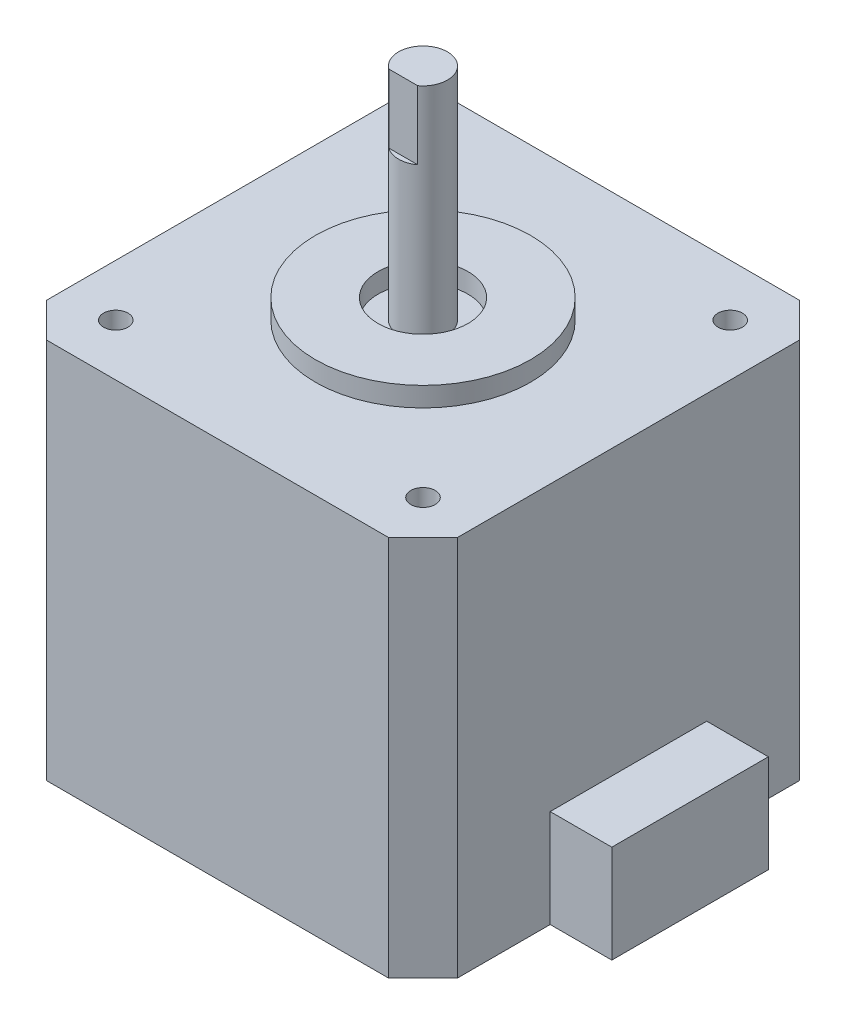
ISO-10303-21;
HEADER;
FILE_DESCRIPTION(('STEP AP214'),'2;1');
FILE_NAME('part.step','',(''),(''),'','','');
FILE_SCHEMA(('AUTOMOTIVE_DESIGN { 1 0 10303 214 1 1 1 1 }'));
ENDSEC;
DATA;
#1=APPLICATION_CONTEXT('core data for automotive mechanical design processes');
#2=APPLICATION_PROTOCOL_DEFINITION('international standard','automotive_design',2000,#1);
#3=PRODUCT_CONTEXT('',#1,'mechanical');
#4=PRODUCT('Part','Part','',(#3));
#5=PRODUCT_RELATED_PRODUCT_CATEGORY('part','',(#4));
#6=PRODUCT_DEFINITION_FORMATION('','',#4);
#7=PRODUCT_DEFINITION_CONTEXT('part definition',#1,'design');
#8=PRODUCT_DEFINITION('design','',#6,#7);
#9=PRODUCT_DEFINITION_SHAPE('','',#8);
#10=(LENGTH_UNIT() NAMED_UNIT(*) SI_UNIT(.MILLI.,.METRE.));
#11=(NAMED_UNIT(*) PLANE_ANGLE_UNIT() SI_UNIT($,.RADIAN.));
#12=(NAMED_UNIT(*) SI_UNIT($,.STERADIAN.) SOLID_ANGLE_UNIT());
#13=UNCERTAINTY_MEASURE_WITH_UNIT(LENGTH_MEASURE(1.E-05),#10,'distance_accuracy_value','');
#14=(GEOMETRIC_REPRESENTATION_CONTEXT(3) GLOBAL_UNCERTAINTY_ASSIGNED_CONTEXT((#13)) GLOBAL_UNIT_ASSIGNED_CONTEXT((#10,
#11,#12)) REPRESENTATION_CONTEXT('',''));
#15=CARTESIAN_POINT('',(0.,0.,0.));
#16=DIRECTION('',(0.,0.,1.));
#17=DIRECTION('',(1.,0.,0.));
#18=AXIS2_PLACEMENT_3D('',#15,#16,#17);
#19=CARTESIAN_POINT('',(42.,39.,-41.0140242480115));
#20=DIRECTION('',(-1.,0.,0.));
#21=DIRECTION('',(0.,0.,1.));
#22=AXIS2_PLACEMENT_3D('',#19,#20,#21);
#23=PLANE('',#22);
#24=DIRECTION('',(0.,-1.,0.));
#25=VECTOR('',#24,1.);
#26=CARTESIAN_POINT('',(42.,0.,-15.5490242480115));
#27=LINE('',#26,#25);
#28=CARTESIAN_POINT('',(42.,10.,-15.5490242480115));
#29=VERTEX_POINT('',#28);
#30=CARTESIAN_POINT('',(42.,0.,-15.5490242480115));
#31=VERTEX_POINT('',#30);
#32=EDGE_CURVE('E50',#29,#31,#27,.T.);
#33=ORIENTED_EDGE('',*,*,#32,.F.);
#34=DIRECTION('',(0.,0.,1.));
#35=VECTOR('',#34,1.);
#36=CARTESIAN_POINT('',(42.,10.,-15.5490242480115));
#37=LINE('',#36,#35);
#38=CARTESIAN_POINT('',(42.,10.,-31.5490242480115));
#39=VERTEX_POINT('',#38);
#40=EDGE_CURVE('E156',#39,#29,#37,.T.);
#41=ORIENTED_EDGE('',*,*,#40,.F.);
#42=DIRECTION('',(0.,1.,0.));
#43=VECTOR('',#42,1.);
#44=CARTESIAN_POINT('',(42.,0.,-31.5490242480115));
#45=LINE('',#44,#43);
#46=CARTESIAN_POINT('',(42.,0.,-31.5490242480115));
#47=VERTEX_POINT('',#46);
#48=EDGE_CURVE('E56',#47,#39,#45,.T.);
#49=ORIENTED_EDGE('',*,*,#48,.F.);
#50=DIRECTION('',(0.,0.,-1.));
#51=VECTOR('',#50,1.);
#52=CARTESIAN_POINT('',(42.,0.,-41.0140242480115));
#53=LINE('',#52,#51);
#54=CARTESIAN_POINT('',(42.,0.,-41.0140242480115));
#55=VERTEX_POINT('',#54);
#56=EDGE_CURVE('E237',#47,#55,#53,.T.);
#57=ORIENTED_EDGE('',*,*,#56,.T.);
#58=DIRECTION('',(0.,-1.,0.));
#59=VECTOR('',#58,1.);
#60=CARTESIAN_POINT('',(42.,39.,-41.0140242480115));
#61=LINE('',#60,#59);
#62=CARTESIAN_POINT('',(42.,39.,-41.0140242480115));
#63=VERTEX_POINT('',#62);
#64=EDGE_CURVE('E263',#63,#55,#61,.T.);
#65=ORIENTED_EDGE('',*,*,#64,.F.);
#66=DIRECTION('',(0.,0.,-1.));
#67=VECTOR('',#66,1.);
#68=CARTESIAN_POINT('',(42.,39.,-41.0140242480115));
#69=LINE('',#68,#67);
#70=CARTESIAN_POINT('',(42.,39.,-6.085092059877));
#71=VERTEX_POINT('',#70);
#72=EDGE_CURVE('E220',#71,#63,#69,.T.);
#73=ORIENTED_EDGE('',*,*,#72,.F.);
#74=DIRECTION('',(0.,-1.,0.));
#75=VECTOR('',#74,1.);
#76=CARTESIAN_POINT('',(42.,39.,-6.085092059877));
#77=LINE('',#76,#75);
#78=CARTESIAN_POINT('',(42.,0.,-6.085092059877));
#79=VERTEX_POINT('',#78);
#80=EDGE_CURVE('E266',#71,#79,#77,.T.);
#81=ORIENTED_EDGE('',*,*,#80,.T.);
#82=EDGE_CURVE('E238',#79,#31,#53,.T.);
#83=ORIENTED_EDGE('',*,*,#82,.T.);
#84=EDGE_LOOP('',(#33,#41,#49,#57,#65,#73,#81,#83));
#85=FACE_BOUND('',#84,.T.);
#86=ADVANCED_FACE('F35',(#85),#23,.F.);
#87=CARTESIAN_POINT('',(38.4644660940673,39.,-2.54955815394427));
#88=DIRECTION('',(0.,0.,-1.));
#89=DIRECTION('',(-1.,0.,0.));
#90=AXIS2_PLACEMENT_3D('',#87,#88,#89);
#91=PLANE('',#90);
#92=DIRECTION('',(1.,0.,0.));
#93=VECTOR('',#92,1.);
#94=CARTESIAN_POINT('',(38.4644660940673,0.,-2.54955815394427));
#95=LINE('',#94,#93);
#96=CARTESIAN_POINT('',(3.53553390593273,0.,-2.54955815394426));
#97=VERTEX_POINT('',#96);
#98=CARTESIAN_POINT('',(38.4644660940673,0.,-2.54955815394427));
#99=VERTEX_POINT('',#98);
#100=EDGE_CURVE('E211',#97,#99,#95,.T.);
#101=ORIENTED_EDGE('',*,*,#100,.T.);
#102=DIRECTION('',(0.,-1.,0.));
#103=VECTOR('',#102,1.);
#104=CARTESIAN_POINT('',(38.4644660940673,39.,-2.54955815394427));
#105=LINE('',#104,#103);
#106=CARTESIAN_POINT('',(38.4644660940673,39.,-2.54955815394427));
#107=VERTEX_POINT('',#106);
#108=EDGE_CURVE('E269',#107,#99,#105,.T.);
#109=ORIENTED_EDGE('',*,*,#108,.F.);
#110=DIRECTION('',(1.,0.,0.));
#111=VECTOR('',#110,1.);
#112=CARTESIAN_POINT('',(38.4644660940673,39.,-2.54955815394427));
#113=LINE('',#112,#111);
#114=CARTESIAN_POINT('',(3.53553390593273,39.,-2.54955815394426));
#115=VERTEX_POINT('',#114);
#116=EDGE_CURVE('E214',#115,#107,#113,.T.);
#117=ORIENTED_EDGE('',*,*,#116,.F.);
#118=DIRECTION('',(0.,-1.,0.));
#119=VECTOR('',#118,1.);
#120=CARTESIAN_POINT('',(3.53553390593273,39.,-2.54955815394426));
#121=LINE('',#120,#119);
#122=EDGE_CURVE('E232',#115,#97,#121,.T.);
#123=ORIENTED_EDGE('',*,*,#122,.T.);
#124=EDGE_LOOP('',(#101,#109,#117,#123));
#125=FACE_BOUND('',#124,.T.);
#126=ADVANCED_FACE('F37',(#125),#91,.F.);
#127=CARTESIAN_POINT('',(42.,39.,-6.085092059877));
#128=DIRECTION('',(-0.707106781186547,0.,-0.707106781186548));
#129=DIRECTION('',(-0.707106781186548,0.,0.707106781186547));
#130=AXIS2_PLACEMENT_3D('',#127,#128,#129);
#131=PLANE('',#130);
#132=DIRECTION('',(0.707106781186548,0.,-0.707106781186547));
#133=VECTOR('',#132,1.);
#134=CARTESIAN_POINT('',(42.,0.,-6.085092059877));
#135=LINE('',#134,#133);
#136=EDGE_CURVE('E235',#99,#79,#135,.T.);
#137=ORIENTED_EDGE('',*,*,#136,.T.);
#138=ORIENTED_EDGE('',*,*,#80,.F.);
#139=DIRECTION('',(0.707106781186548,0.,-0.707106781186547));
#140=VECTOR('',#139,1.);
#141=CARTESIAN_POINT('',(42.,39.,-6.085092059877));
#142=LINE('',#141,#140);
#143=EDGE_CURVE('E217',#107,#71,#142,.T.);
#144=ORIENTED_EDGE('',*,*,#143,.F.);
#145=ORIENTED_EDGE('',*,*,#108,.T.);
#146=EDGE_LOOP('',(#137,#138,#144,#145));
#147=FACE_BOUND('',#146,.T.);
#148=ADVANCED_FACE('F297',(#147),#131,.F.);
#149=CARTESIAN_POINT('',(38.4644660940673,39.,-44.5495581539443));
#150=DIRECTION('',(-0.707106781186549,0.,0.707106781186546));
#151=DIRECTION('',(0.707106781186546,0.,0.707106781186549));
#152=AXIS2_PLACEMENT_3D('',#149,#150,#151);
#153=PLANE('',#152);
#154=DIRECTION('',(-0.707106781186546,0.,-0.707106781186549));
#155=VECTOR('',#154,1.);
#156=CARTESIAN_POINT('',(38.4644660940673,0.,-44.5495581539443));
#157=LINE('',#156,#155);
#158=CARTESIAN_POINT('',(38.4644660940673,0.,-44.5495581539443));
#159=VERTEX_POINT('',#158);
#160=EDGE_CURVE('E240',#55,#159,#157,.T.);
#161=ORIENTED_EDGE('',*,*,#160,.T.);
#162=DIRECTION('',(0.,-1.,0.));
#163=VECTOR('',#162,1.);
#164=CARTESIAN_POINT('',(38.4644660940673,39.,-44.5495581539443));
#165=LINE('',#164,#163);
#166=CARTESIAN_POINT('',(38.4644660940673,39.,-44.5495581539443));
#167=VERTEX_POINT('',#166);
#168=EDGE_CURVE('E260',#167,#159,#165,.T.);
#169=ORIENTED_EDGE('',*,*,#168,.F.);
#170=DIRECTION('',(-0.707106781186546,0.,-0.707106781186549));
#171=VECTOR('',#170,1.);
#172=CARTESIAN_POINT('',(38.4644660940673,39.,-44.5495581539443));
#173=LINE('',#172,#171);
#174=EDGE_CURVE('E222',#63,#167,#173,.T.);
#175=ORIENTED_EDGE('',*,*,#174,.F.);
#176=ORIENTED_EDGE('',*,*,#64,.T.);
#177=EDGE_LOOP('',(#161,#169,#175,#176));
#178=FACE_BOUND('',#177,.T.);
#179=ADVANCED_FACE('F305',(#178),#153,.F.);
#180=CARTESIAN_POINT('',(3.53553390593274,39.,-44.5495581539443));
#181=DIRECTION('',(0.,0.,1.));
#182=DIRECTION('',(1.,0.,0.));
#183=AXIS2_PLACEMENT_3D('',#180,#181,#182);
#184=PLANE('',#183);
#185=DIRECTION('',(-1.,0.,0.));
#186=VECTOR('',#185,1.);
#187=CARTESIAN_POINT('',(3.53553390593274,0.,-44.5495581539443));
#188=LINE('',#187,#186);
#189=CARTESIAN_POINT('',(3.53553390593274,0.,-44.5495581539443));
#190=VERTEX_POINT('',#189);
#191=EDGE_CURVE('E242',#159,#190,#188,.T.);
#192=ORIENTED_EDGE('',*,*,#191,.T.);
#193=DIRECTION('',(0.,-1.,0.));
#194=VECTOR('',#193,1.);
#195=CARTESIAN_POINT('',(3.53553390593274,39.,-44.5495581539443));
#196=LINE('',#195,#194);
#197=CARTESIAN_POINT('',(3.53553390593274,39.,-44.5495581539443));
#198=VERTEX_POINT('',#197);
#199=EDGE_CURVE('E257',#198,#190,#196,.T.);
#200=ORIENTED_EDGE('',*,*,#199,.F.);
#201=DIRECTION('',(-1.,0.,0.));
#202=VECTOR('',#201,1.);
#203=CARTESIAN_POINT('',(3.53553390593274,39.,-44.5495581539443));
#204=LINE('',#203,#202);
#205=EDGE_CURVE('E224',#167,#198,#204,.T.);
#206=ORIENTED_EDGE('',*,*,#205,.F.);
#207=ORIENTED_EDGE('',*,*,#168,.T.);
#208=EDGE_LOOP('',(#192,#200,#206,#207));
#209=FACE_BOUND('',#208,.T.);
#210=ADVANCED_FACE('F309',(#209),#184,.F.);
#211=CARTESIAN_POINT('',(0.,39.,-41.0140242480115));
#212=DIRECTION('',(0.707106781186546,0.,0.707106781186549));
#213=DIRECTION('',(0.707106781186549,0.,-0.707106781186546));
#214=AXIS2_PLACEMENT_3D('',#211,#212,#213);
#215=PLANE('',#214);
#216=DIRECTION('',(-0.707106781186549,0.,0.707106781186546));
#217=VECTOR('',#216,1.);
#218=CARTESIAN_POINT('',(0.,0.,-41.0140242480115));
#219=LINE('',#218,#217);
#220=CARTESIAN_POINT('',(0.,0.,-41.0140242480115));
#221=VERTEX_POINT('',#220);
#222=EDGE_CURVE('E244',#190,#221,#219,.T.);
#223=ORIENTED_EDGE('',*,*,#222,.T.);
#224=DIRECTION('',(0.,-1.,0.));
#225=VECTOR('',#224,1.);
#226=CARTESIAN_POINT('',(0.,39.,-41.0140242480115));
#227=LINE('',#226,#225);
#228=CARTESIAN_POINT('',(0.,39.,-41.0140242480115));
#229=VERTEX_POINT('',#228);
#230=EDGE_CURVE('E254',#229,#221,#227,.T.);
#231=ORIENTED_EDGE('',*,*,#230,.F.);
#232=DIRECTION('',(-0.707106781186549,0.,0.707106781186546));
#233=VECTOR('',#232,1.);
#234=CARTESIAN_POINT('',(0.,39.,-41.0140242480115));
#235=LINE('',#234,#233);
#236=EDGE_CURVE('E226',#198,#229,#235,.T.);
#237=ORIENTED_EDGE('',*,*,#236,.F.);
#238=ORIENTED_EDGE('',*,*,#199,.T.);
#239=EDGE_LOOP('',(#223,#231,#237,#238));
#240=FACE_BOUND('',#239,.T.);
#241=ADVANCED_FACE('F314',(#240),#215,.F.);
#242=CARTESIAN_POINT('',(0.,39.,-6.085092059877));
#243=DIRECTION('',(1.,0.,0.));
#244=DIRECTION('',(0.,0.,-1.));
#245=AXIS2_PLACEMENT_3D('',#242,#243,#244);
#246=PLANE('',#245);
#247=DIRECTION('',(0.,0.,1.));
#248=VECTOR('',#247,1.);
#249=CARTESIAN_POINT('',(0.,0.,-6.085092059877));
#250=LINE('',#249,#248);
#251=CARTESIAN_POINT('',(0.,0.,-6.085092059877));
#252=VERTEX_POINT('',#251);
#253=EDGE_CURVE('E246',#221,#252,#250,.T.);
#254=ORIENTED_EDGE('',*,*,#253,.T.);
#255=DIRECTION('',(0.,-1.,0.));
#256=VECTOR('',#255,1.);
#257=CARTESIAN_POINT('',(0.,39.,-6.085092059877));
#258=LINE('',#257,#256);
#259=CARTESIAN_POINT('',(0.,39.,-6.085092059877));
#260=VERTEX_POINT('',#259);
#261=EDGE_CURVE('E251',#260,#252,#258,.T.);
#262=ORIENTED_EDGE('',*,*,#261,.F.);
#263=DIRECTION('',(0.,0.,1.));
#264=VECTOR('',#263,1.);
#265=CARTESIAN_POINT('',(0.,39.,-6.085092059877));
#266=LINE('',#265,#264);
#267=EDGE_CURVE('E228',#229,#260,#266,.T.);
#268=ORIENTED_EDGE('',*,*,#267,.F.);
#269=ORIENTED_EDGE('',*,*,#230,.T.);
#270=EDGE_LOOP('',(#254,#262,#268,#269));
#271=FACE_BOUND('',#270,.T.);
#272=ADVANCED_FACE('F318',(#271),#246,.F.);
#273=CARTESIAN_POINT('',(3.53553390593273,39.,-2.54955815394426));
#274=DIRECTION('',(0.707106781186549,0.,-0.707106781186546));
#275=DIRECTION('',(-0.707106781186546,0.,-0.707106781186549));
#276=AXIS2_PLACEMENT_3D('',#273,#274,#275);
#277=PLANE('',#276);
#278=DIRECTION('',(0.707106781186546,0.,0.707106781186549));
#279=VECTOR('',#278,1.);
#280=CARTESIAN_POINT('',(3.53553390593273,0.,-2.54955815394426));
#281=LINE('',#280,#279);
#282=EDGE_CURVE('E218',#252,#97,#281,.T.);
#283=ORIENTED_EDGE('',*,*,#282,.T.);
#284=ORIENTED_EDGE('',*,*,#122,.F.);
#285=DIRECTION('',(0.707106781186546,0.,0.707106781186549));
#286=VECTOR('',#285,1.);
#287=CARTESIAN_POINT('',(3.53553390593273,39.,-2.54955815394426));
#288=LINE('',#287,#286);
#289=EDGE_CURVE('E230',#260,#115,#288,.T.);
#290=ORIENTED_EDGE('',*,*,#289,.F.);
#291=ORIENTED_EDGE('',*,*,#261,.T.);
#292=EDGE_LOOP('',(#283,#284,#290,#291));
#293=FACE_BOUND('',#292,.T.);
#294=ADVANCED_FACE('F279',(#293),#277,.F.);
#295=CARTESIAN_POINT('',(0.,39.,0.));
#296=DIRECTION('',(0.,-1.,0.));
#297=DIRECTION('',(0.,0.,-1.));
#298=AXIS2_PLACEMENT_3D('',#295,#296,#297);
#299=PLANE('',#298);
#300=CARTESIAN_POINT('',(21.,39.,-23.5495581539443));
#301=DIRECTION('',(0.,-1.,0.));
#302=DIRECTION('',(0.,0.,-1.));
#303=AXIS2_PLACEMENT_3D('',#300,#301,#302);
#304=CIRCLE('',#303,11.);
#305=CARTESIAN_POINT('',(21.,39.,-34.5495581539443));
#306=VERTEX_POINT('',#305);
#307=EDGE_CURVE('E43',#306,#306,#304,.F.);
#308=ORIENTED_EDGE('',*,*,#307,.F.);
#309=EDGE_LOOP('',(#308));
#310=FACE_BOUND('',#309,.T.);
#311=CARTESIAN_POINT('',(5.3,39.,-7.84955815394426));
#312=DIRECTION('',(0.,1.,0.));
#313=DIRECTION('',(0.,0.,1.));
#314=AXIS2_PLACEMENT_3D('',#311,#312,#313);
#315=CIRCLE('',#314,1.25);
#316=CARTESIAN_POINT('',(5.3,39.,-6.59955815394426));
#317=VERTEX_POINT('',#316);
#318=EDGE_CURVE('E189',#317,#317,#315,.T.);
#319=ORIENTED_EDGE('',*,*,#318,.F.);
#320=EDGE_LOOP('',(#319));
#321=FACE_BOUND('',#320,.T.);
#322=CARTESIAN_POINT('',(36.7,39.,-7.84955815394426));
#323=DIRECTION('',(0.,1.,0.));
#324=DIRECTION('',(0.,0.,1.));
#325=AXIS2_PLACEMENT_3D('',#322,#323,#324);
#326=CIRCLE('',#325,1.25);
#327=CARTESIAN_POINT('',(36.7,39.,-6.59955815394426));
#328=VERTEX_POINT('',#327);
#329=EDGE_CURVE('E200',#328,#328,#326,.T.);
#330=ORIENTED_EDGE('',*,*,#329,.F.);
#331=EDGE_LOOP('',(#330));
#332=FACE_BOUND('',#331,.T.);
#333=CARTESIAN_POINT('',(36.7,39.,-39.2495581539443));
#334=DIRECTION('',(0.,1.,0.));
#335=DIRECTION('',(0.,0.,1.));
#336=AXIS2_PLACEMENT_3D('',#333,#334,#335);
#337=CIRCLE('',#336,1.25);
#338=CARTESIAN_POINT('',(36.7,39.,-37.9995581539443));
#339=VERTEX_POINT('',#338);
#340=EDGE_CURVE('E194',#339,#339,#337,.T.);
#341=ORIENTED_EDGE('',*,*,#340,.F.);
#342=EDGE_LOOP('',(#341));
#343=FACE_BOUND('',#342,.T.);
#344=CARTESIAN_POINT('',(5.3,39.,-39.2495581539443));
#345=DIRECTION('',(0.,1.,0.));
#346=DIRECTION('',(0.,0.,1.));
#347=AXIS2_PLACEMENT_3D('',#344,#345,#346);
#348=CIRCLE('',#347,1.25);
#349=CARTESIAN_POINT('',(5.3,39.,-37.9995581539443));
#350=VERTEX_POINT('',#349);
#351=EDGE_CURVE('E193',#350,#350,#348,.T.);
#352=ORIENTED_EDGE('',*,*,#351,.F.);
#353=EDGE_LOOP('',(#352));
#354=FACE_BOUND('',#353,.T.);
#355=ORIENTED_EDGE('',*,*,#116,.T.);
#356=ORIENTED_EDGE('',*,*,#143,.T.);
#357=ORIENTED_EDGE('',*,*,#72,.T.);
#358=ORIENTED_EDGE('',*,*,#174,.T.);
#359=ORIENTED_EDGE('',*,*,#205,.T.);
#360=ORIENTED_EDGE('',*,*,#236,.T.);
#361=ORIENTED_EDGE('',*,*,#267,.T.);
#362=ORIENTED_EDGE('',*,*,#289,.T.);
#363=EDGE_LOOP('',(#355,#356,#357,#358,#359,#360,#361,#362));
#364=FACE_BOUND('',#363,.T.);
#365=ADVANCED_FACE('F276',(#310,#321,#332,#343,#354,#364),#299,.F.);
#366=CARTESIAN_POINT('',(0.,0.,0.));
#367=DIRECTION('',(0.,-1.,0.));
#368=DIRECTION('',(0.,0.,-1.));
#369=AXIS2_PLACEMENT_3D('',#366,#367,#368);
#370=PLANE('',#369);
#371=CARTESIAN_POINT('',(5.3,0.,-7.84955815394426));
#372=DIRECTION('',(0.,1.,0.));
#373=DIRECTION('',(0.,0.,1.));
#374=AXIS2_PLACEMENT_3D('',#371,#372,#373);
#375=CIRCLE('',#374,1.25);
#376=CARTESIAN_POINT('',(5.3,0.,-6.59955815394426));
#377=VERTEX_POINT('',#376);
#378=EDGE_CURVE('E203',#377,#377,#375,.T.);
#379=ORIENTED_EDGE('',*,*,#378,.T.);
#380=EDGE_LOOP('',(#379));
#381=FACE_BOUND('',#380,.T.);
#382=CARTESIAN_POINT('',(36.7,0.,-7.84955815394426));
#383=DIRECTION('',(0.,1.,0.));
#384=DIRECTION('',(0.,0.,1.));
#385=AXIS2_PLACEMENT_3D('',#382,#383,#384);
#386=CIRCLE('',#385,1.25);
#387=CARTESIAN_POINT('',(36.7,0.,-6.59955815394426));
#388=VERTEX_POINT('',#387);
#389=EDGE_CURVE('E197',#388,#388,#386,.T.);
#390=ORIENTED_EDGE('',*,*,#389,.T.);
#391=EDGE_LOOP('',(#390));
#392=FACE_BOUND('',#391,.T.);
#393=CARTESIAN_POINT('',(36.7,0.,-39.2495581539443));
#394=DIRECTION('',(0.,1.,0.));
#395=DIRECTION('',(0.,0.,1.));
#396=AXIS2_PLACEMENT_3D('',#393,#394,#395);
#397=CIRCLE('',#396,1.25);
#398=CARTESIAN_POINT('',(36.7,0.,-37.9995581539443));
#399=VERTEX_POINT('',#398);
#400=EDGE_CURVE('E190',#399,#399,#397,.T.);
#401=ORIENTED_EDGE('',*,*,#400,.T.);
#402=EDGE_LOOP('',(#401));
#403=FACE_BOUND('',#402,.T.);
#404=CARTESIAN_POINT('',(5.3,0.,-39.2495581539443));
#405=DIRECTION('',(0.,1.,0.));
#406=DIRECTION('',(0.,0.,1.));
#407=AXIS2_PLACEMENT_3D('',#404,#405,#406);
#408=CIRCLE('',#407,1.25);
#409=CARTESIAN_POINT('',(5.3,0.,-37.9995581539443));
#410=VERTEX_POINT('',#409);
#411=EDGE_CURVE('E208',#410,#410,#408,.T.);
#412=ORIENTED_EDGE('',*,*,#411,.T.);
#413=EDGE_LOOP('',(#412));
#414=FACE_BOUND('',#413,.T.);
#415=ORIENTED_EDGE('',*,*,#100,.F.);
#416=ORIENTED_EDGE('',*,*,#282,.F.);
#417=ORIENTED_EDGE('',*,*,#253,.F.);
#418=ORIENTED_EDGE('',*,*,#222,.F.);
#419=ORIENTED_EDGE('',*,*,#191,.F.);
#420=ORIENTED_EDGE('',*,*,#160,.F.);
#421=ORIENTED_EDGE('',*,*,#56,.F.);
#422=DIRECTION('',(-1.,0.,0.));
#423=VECTOR('',#422,1.);
#424=CARTESIAN_POINT('',(48.3,0.,-31.5490242480115));
#425=LINE('',#424,#423);
#426=CARTESIAN_POINT('',(48.3,0.,-31.5490242480115));
#427=VERTEX_POINT('',#426);
#428=EDGE_CURVE('E143',#427,#47,#425,.T.);
#429=ORIENTED_EDGE('',*,*,#428,.F.);
#430=DIRECTION('',(0.,0.,-1.));
#431=VECTOR('',#430,1.);
#432=CARTESIAN_POINT('',(48.3,0.,-15.5490242480115));
#433=LINE('',#432,#431);
#434=CARTESIAN_POINT('',(48.3,0.,-15.5490242480115));
#435=VERTEX_POINT('',#434);
#436=EDGE_CURVE('E135',#435,#427,#433,.T.);
#437=ORIENTED_EDGE('',*,*,#436,.F.);
#438=DIRECTION('',(-1.,0.,0.));
#439=VECTOR('',#438,1.);
#440=CARTESIAN_POINT('',(48.3,0.,-15.5490242480115));
#441=LINE('',#440,#439);
#442=EDGE_CURVE('E141',#435,#31,#441,.T.);
#443=ORIENTED_EDGE('',*,*,#442,.T.);
#444=ORIENTED_EDGE('',*,*,#82,.F.);
#445=ORIENTED_EDGE('',*,*,#136,.F.);
#446=EDGE_LOOP('',(#415,#416,#417,#418,#419,#420,#421,#429,#437,#443,#444,#445));
#447=FACE_BOUND('',#446,.T.);
#448=ADVANCED_FACE('F138',(#381,#392,#403,#414,#447),#370,.T.);
#449=CARTESIAN_POINT('',(5.3,0.,-39.2495581539443));
#450=DIRECTION('',(0.,1.,0.));
#451=DIRECTION('',(0.,0.,1.));
#452=AXIS2_PLACEMENT_3D('',#449,#450,#451);
#453=CYLINDRICAL_SURFACE('',#452,1.25);
#454=ORIENTED_EDGE('',*,*,#411,.F.);
#455=EDGE_LOOP('',(#454));
#456=FACE_BOUND('',#455,.T.);
#457=ORIENTED_EDGE('',*,*,#351,.T.);
#458=EDGE_LOOP('',(#457));
#459=FACE_BOUND('',#458,.T.);
#460=ADVANCED_FACE('F367',(#456,#459),#453,.F.);
#461=CARTESIAN_POINT('',(36.7,0.,-39.2495581539443));
#462=DIRECTION('',(0.,1.,0.));
#463=DIRECTION('',(0.,0.,1.));
#464=AXIS2_PLACEMENT_3D('',#461,#462,#463);
#465=CYLINDRICAL_SURFACE('',#464,1.25);
#466=ORIENTED_EDGE('',*,*,#400,.F.);
#467=EDGE_LOOP('',(#466));
#468=FACE_BOUND('',#467,.T.);
#469=ORIENTED_EDGE('',*,*,#340,.T.);
#470=EDGE_LOOP('',(#469));
#471=FACE_BOUND('',#470,.T.);
#472=ADVANCED_FACE('F372',(#468,#471),#465,.F.);
#473=CARTESIAN_POINT('',(36.7,0.,-7.84955815394426));
#474=DIRECTION('',(0.,1.,0.));
#475=DIRECTION('',(0.,0.,1.));
#476=AXIS2_PLACEMENT_3D('',#473,#474,#475);
#477=CYLINDRICAL_SURFACE('',#476,1.25);
#478=ORIENTED_EDGE('',*,*,#389,.F.);
#479=EDGE_LOOP('',(#478));
#480=FACE_BOUND('',#479,.T.);
#481=ORIENTED_EDGE('',*,*,#329,.T.);
#482=EDGE_LOOP('',(#481));
#483=FACE_BOUND('',#482,.T.);
#484=ADVANCED_FACE('F378',(#480,#483),#477,.F.);
#485=CARTESIAN_POINT('',(5.3,0.,-7.84955815394426));
#486=DIRECTION('',(0.,1.,0.));
#487=DIRECTION('',(0.,0.,1.));
#488=AXIS2_PLACEMENT_3D('',#485,#486,#487);
#489=CYLINDRICAL_SURFACE('',#488,1.25);
#490=ORIENTED_EDGE('',*,*,#378,.F.);
#491=EDGE_LOOP('',(#490));
#492=FACE_BOUND('',#491,.T.);
#493=ORIENTED_EDGE('',*,*,#318,.T.);
#494=EDGE_LOOP('',(#493));
#495=FACE_BOUND('',#494,.T.);
#496=ADVANCED_FACE('F374',(#492,#495),#489,.F.);
#497=CARTESIAN_POINT('',(21.,41.,-23.5495581539443));
#498=DIRECTION('',(0.,1.,0.));
#499=DIRECTION('',(0.,0.,1.));
#500=AXIS2_PLACEMENT_3D('',#497,#498,#499);
#501=PLANE('',#500);
#502=CARTESIAN_POINT('',(21.,41.,-23.5495581539443));
#503=DIRECTION('',(0.,1.,0.));
#504=DIRECTION('',(0.,0.,1.));
#505=AXIS2_PLACEMENT_3D('',#502,#503,#504);
#506=CIRCLE('',#505,11.);
#507=CARTESIAN_POINT('',(21.,41.,-12.5495581539443));
#508=VERTEX_POINT('',#507);
#509=EDGE_CURVE('E184',#508,#508,#506,.T.);
#510=ORIENTED_EDGE('',*,*,#509,.T.);
#511=EDGE_LOOP('',(#510));
#512=FACE_BOUND('',#511,.T.);
#513=CARTESIAN_POINT('',(21.,41.,-23.5495581539443));
#514=DIRECTION('',(0.,1.,0.));
#515=DIRECTION('',(0.,0.,1.));
#516=AXIS2_PLACEMENT_3D('',#513,#514,#515);
#517=CIRCLE('',#516,4.6);
#518=CARTESIAN_POINT('',(21.,41.,-18.9495581539443));
#519=VERTEX_POINT('',#518);
#520=EDGE_CURVE('E181',#519,#519,#517,.T.);
#521=ORIENTED_EDGE('',*,*,#520,.F.);
#522=EDGE_LOOP('',(#521));
#523=FACE_BOUND('',#522,.T.);
#524=ADVANCED_FACE('F377',(#512,#523),#501,.T.);
#525=CARTESIAN_POINT('',(21.,41.,-23.5495581539443));
#526=DIRECTION('',(0.,-1.,0.));
#527=DIRECTION('',(0.,0.,-1.));
#528=AXIS2_PLACEMENT_3D('',#525,#526,#527);
#529=CYLINDRICAL_SURFACE('',#528,11.);
#530=ORIENTED_EDGE('',*,*,#509,.F.);
#531=EDGE_LOOP('',(#530));
#532=FACE_BOUND('',#531,.T.);
#533=ORIENTED_EDGE('',*,*,#307,.T.);
#534=EDGE_LOOP('',(#533));
#535=FACE_BOUND('',#534,.T.);
#536=ADVANCED_FACE('F274',(#532,#535),#529,.T.);
#537=CARTESIAN_POINT('',(21.,41.,-23.5495581539443));
#538=DIRECTION('',(0.,-1.,0.));
#539=DIRECTION('',(0.,0.,-1.));
#540=AXIS2_PLACEMENT_3D('',#537,#538,#539);
#541=CYLINDRICAL_SURFACE('',#540,4.6);
#542=ORIENTED_EDGE('',*,*,#520,.T.);
#543=EDGE_LOOP('',(#542));
#544=FACE_BOUND('',#543,.T.);
#545=CARTESIAN_POINT('',(21.,39.,-23.5495581539443));
#546=DIRECTION('',(0.,1.,0.));
#547=DIRECTION('',(0.,0.,1.));
#548=AXIS2_PLACEMENT_3D('',#545,#546,#547);
#549=CIRCLE('',#548,4.6);
#550=CARTESIAN_POINT('',(21.,39.,-18.9495581539443));
#551=VERTEX_POINT('',#550);
#552=EDGE_CURVE('E180',#551,#551,#549,.T.);
#553=ORIENTED_EDGE('',*,*,#552,.F.);
#554=EDGE_LOOP('',(#553));
#555=FACE_BOUND('',#554,.T.);
#556=ADVANCED_FACE('F388',(#544,#555),#541,.F.);
#557=CARTESIAN_POINT('',(21.,39.,-23.5495581539443));
#558=DIRECTION('',(0.,-1.,0.));
#559=DIRECTION('',(0.,0.,-1.));
#560=AXIS2_PLACEMENT_3D('',#557,#558,#559);
#561=CIRCLE('',#560,2.5);
#562=CARTESIAN_POINT('',(21.,39.,-26.0495581539443));
#563=VERTEX_POINT('',#562);
#564=EDGE_CURVE('E11',#563,#563,#561,.F.);
#565=ORIENTED_EDGE('',*,*,#564,.F.);
#566=EDGE_LOOP('',(#565));
#567=FACE_BOUND('',#566,.T.);
#568=ORIENTED_EDGE('',*,*,#552,.T.);
#569=EDGE_LOOP('',(#568));
#570=FACE_BOUND('',#569,.T.);
#571=ADVANCED_FACE('F281',(#567,#570),#299,.F.);
#572=CARTESIAN_POINT('',(21.,61.5,-23.5495581539443));
#573=DIRECTION('',(0.,-1.,0.));
#574=DIRECTION('',(0.,0.,-1.));
#575=AXIS2_PLACEMENT_3D('',#572,#573,#574);
#576=CYLINDRICAL_SURFACE('',#575,2.5);
#577=CARTESIAN_POINT('',(21.,61.5,-23.5495581539443));
#578=DIRECTION('',(0.,1.,0.));
#579=DIRECTION('',(0.,0.,1.));
#580=AXIS2_PLACEMENT_3D('',#577,#578,#579);
#581=CIRCLE('',#580,2.5);
#582=CARTESIAN_POINT('',(22.4749091596639,61.5,-21.5309836641769));
#583=VERTEX_POINT('',#582);
#584=CARTESIAN_POINT('',(19.5250908403361,61.5,-21.5309836641769));
#585=VERTEX_POINT('',#584);
#586=EDGE_CURVE('E175',#583,#585,#581,.T.);
#587=ORIENTED_EDGE('',*,*,#586,.F.);
#588=DIRECTION('',(0.,1.,0.));
#589=VECTOR('',#588,1.);
#590=CARTESIAN_POINT('',(22.4749091596639,54.5,-21.5309836641769));
#591=LINE('',#590,#589);
#592=CARTESIAN_POINT('',(22.4749091596639,54.5,-21.5309836641769));
#593=VERTEX_POINT('',#592);
#594=EDGE_CURVE('E173',#593,#583,#591,.T.);
#595=ORIENTED_EDGE('',*,*,#594,.F.);
#596=CARTESIAN_POINT('',(21.,54.5,-23.5495581539443));
#597=DIRECTION('',(0.,-1.,0.));
#598=DIRECTION('',(0.,0.,-1.));
#599=AXIS2_PLACEMENT_3D('',#596,#597,#598);
#600=CIRCLE('',#599,2.5);
#601=CARTESIAN_POINT('',(19.5250908403361,54.5,-21.5309836641769));
#602=VERTEX_POINT('',#601);
#603=EDGE_CURVE('E169',#593,#602,#600,.T.);
#604=ORIENTED_EDGE('',*,*,#603,.T.);
#605=DIRECTION('',(0.,1.,0.));
#606=VECTOR('',#605,1.);
#607=CARTESIAN_POINT('',(19.5250908403361,54.5,-21.5309836641769));
#608=LINE('',#607,#606);
#609=EDGE_CURVE('E171',#602,#585,#608,.T.);
#610=ORIENTED_EDGE('',*,*,#609,.T.);
#611=EDGE_LOOP('',(#587,#595,#604,#610));
#612=FACE_BOUND('',#611,.T.);
#613=ORIENTED_EDGE('',*,*,#564,.T.);
#614=EDGE_LOOP('',(#613));
#615=FACE_BOUND('',#614,.T.);
#616=ADVANCED_FACE('F396',(#612,#615),#576,.T.);
#617=CARTESIAN_POINT('',(21.,61.5,-23.5495581539443));
#618=DIRECTION('',(0.,1.,0.));
#619=DIRECTION('',(0.,0.,1.));
#620=AXIS2_PLACEMENT_3D('',#617,#618,#619);
#621=PLANE('',#620);
#622=DIRECTION('',(-1.,0.,0.));
#623=VECTOR('',#622,1.);
#624=CARTESIAN_POINT('',(22.4749091596639,61.5,-21.5309836641769));
#625=LINE('',#624,#623);
#626=EDGE_CURVE('E159',#583,#585,#625,.T.);
#627=ORIENTED_EDGE('',*,*,#626,.F.);
#628=ORIENTED_EDGE('',*,*,#586,.T.);
#629=EDGE_LOOP('',(#627,#628));
#630=FACE_BOUND('',#629,.T.);
#631=ADVANCED_FACE('F399',(#630),#621,.T.);
#632=CARTESIAN_POINT('',(22.4749091596639,54.5,-21.5309836641769));
#633=DIRECTION('',(0.,0.,-1.));
#634=DIRECTION('',(-1.,0.,0.));
#635=AXIS2_PLACEMENT_3D('',#632,#633,#634);
#636=PLANE('',#635);
#637=ORIENTED_EDGE('',*,*,#626,.T.);
#638=ORIENTED_EDGE('',*,*,#609,.F.);
#639=DIRECTION('',(-1.,0.,0.));
#640=VECTOR('',#639,1.);
#641=CARTESIAN_POINT('',(22.4749091596639,54.5,-21.5309836641769));
#642=LINE('',#641,#640);
#643=EDGE_CURVE('E161',#593,#602,#642,.T.);
#644=ORIENTED_EDGE('',*,*,#643,.F.);
#645=ORIENTED_EDGE('',*,*,#594,.T.);
#646=EDGE_LOOP('',(#637,#638,#644,#645));
#647=FACE_BOUND('',#646,.T.);
#648=ADVANCED_FACE('F403',(#647),#636,.F.);
#649=CARTESIAN_POINT('',(21.,54.5,-23.5495581539443));
#650=DIRECTION('',(0.,-1.,0.));
#651=DIRECTION('',(0.,0.,-1.));
#652=AXIS2_PLACEMENT_3D('',#649,#650,#651);
#653=PLANE('',#652);
#654=ORIENTED_EDGE('',*,*,#643,.T.);
#655=ORIENTED_EDGE('',*,*,#603,.F.);
#656=EDGE_LOOP('',(#654,#655));
#657=FACE_BOUND('',#656,.T.);
#658=ADVANCED_FACE('F407',(#657),#653,.F.);
#659=CARTESIAN_POINT('',(48.3,0.,-15.5490242480115));
#660=DIRECTION('',(0.,0.,-1.));
#661=DIRECTION('',(-1.,0.,0.));
#662=AXIS2_PLACEMENT_3D('',#659,#660,#661);
#663=PLANE('',#662);
#664=ORIENTED_EDGE('',*,*,#32,.T.);
#665=ORIENTED_EDGE('',*,*,#442,.F.);
#666=DIRECTION('',(0.,-1.,0.));
#667=VECTOR('',#666,1.);
#668=CARTESIAN_POINT('',(48.3,0.,-15.5490242480115));
#669=LINE('',#668,#667);
#670=CARTESIAN_POINT('',(48.3,10.,-15.5490242480115));
#671=VERTEX_POINT('',#670);
#672=EDGE_CURVE('E147',#671,#435,#669,.T.);
#673=ORIENTED_EDGE('',*,*,#672,.F.);
#674=DIRECTION('',(-1.,0.,0.));
#675=VECTOR('',#674,1.);
#676=CARTESIAN_POINT('',(48.3,10.,-15.5490242480115));
#677=LINE('',#676,#675);
#678=EDGE_CURVE('E327',#671,#29,#677,.T.);
#679=ORIENTED_EDGE('',*,*,#678,.T.);
#680=EDGE_LOOP('',(#664,#665,#673,#679));
#681=FACE_BOUND('',#680,.T.);
#682=ADVANCED_FACE('F158',(#681),#663,.F.);
#683=CARTESIAN_POINT('',(48.3,0.,-31.5490242480115));
#684=DIRECTION('',(0.,0.,1.));
#685=DIRECTION('',(1.,0.,0.));
#686=AXIS2_PLACEMENT_3D('',#683,#684,#685);
#687=PLANE('',#686);
#688=ORIENTED_EDGE('',*,*,#48,.T.);
#689=DIRECTION('',(-1.,0.,0.));
#690=VECTOR('',#689,1.);
#691=CARTESIAN_POINT('',(48.3,10.,-31.5490242480115));
#692=LINE('',#691,#690);
#693=CARTESIAN_POINT('',(48.3,10.,-31.5490242480115));
#694=VERTEX_POINT('',#693);
#695=EDGE_CURVE('E163',#694,#39,#692,.T.);
#696=ORIENTED_EDGE('',*,*,#695,.F.);
#697=DIRECTION('',(0.,1.,0.));
#698=VECTOR('',#697,1.);
#699=CARTESIAN_POINT('',(48.3,0.,-31.5490242480115));
#700=LINE('',#699,#698);
#701=EDGE_CURVE('E146',#427,#694,#700,.T.);
#702=ORIENTED_EDGE('',*,*,#701,.F.);
#703=ORIENTED_EDGE('',*,*,#428,.T.);
#704=EDGE_LOOP('',(#688,#696,#702,#703));
#705=FACE_BOUND('',#704,.T.);
#706=ADVANCED_FACE('F323',(#705),#687,.F.);
#707=CARTESIAN_POINT('',(48.3,10.,-15.5490242480115));
#708=DIRECTION('',(0.,-1.,0.));
#709=DIRECTION('',(0.,0.,-1.));
#710=AXIS2_PLACEMENT_3D('',#707,#708,#709);
#711=PLANE('',#710);
#712=ORIENTED_EDGE('',*,*,#40,.T.);
#713=ORIENTED_EDGE('',*,*,#678,.F.);
#714=DIRECTION('',(0.,0.,1.));
#715=VECTOR('',#714,1.);
#716=CARTESIAN_POINT('',(48.3,10.,-15.5490242480115));
#717=LINE('',#716,#715);
#718=EDGE_CURVE('E152',#694,#671,#717,.T.);
#719=ORIENTED_EDGE('',*,*,#718,.F.);
#720=ORIENTED_EDGE('',*,*,#695,.T.);
#721=EDGE_LOOP('',(#712,#713,#719,#720));
#722=FACE_BOUND('',#721,.T.);
#723=ADVANCED_FACE('F334',(#722),#711,.F.);
#724=CARTESIAN_POINT('',(48.3,0.,0.));
#725=DIRECTION('',(-1.,0.,0.));
#726=DIRECTION('',(0.,0.,1.));
#727=AXIS2_PLACEMENT_3D('',#724,#725,#726);
#728=PLANE('',#727);
#729=ORIENTED_EDGE('',*,*,#672,.T.);
#730=ORIENTED_EDGE('',*,*,#436,.T.);
#731=ORIENTED_EDGE('',*,*,#701,.T.);
#732=ORIENTED_EDGE('',*,*,#718,.T.);
#733=EDGE_LOOP('',(#729,#730,#731,#732));
#734=FACE_BOUND('',#733,.T.);
#735=ADVANCED_FACE('F150',(#734),#728,.F.);
#736=CLOSED_SHELL('',(#86,#126,#148,#179,#210,#241,#272,#294,#365,#448,#460,#472,#484,#496,#524,
#536,#556,#571,#616,#631,#648,#658,#682,#706,#723,#735));
#737=MANIFOLD_SOLID_BREP('B2',#736);
#738=ADVANCED_BREP_SHAPE_REPRESENTATION('',(#18,#737),#14);
#739=SHAPE_DEFINITION_REPRESENTATION(#9,#738);
ENDSEC;
END-ISO-10303-21;
